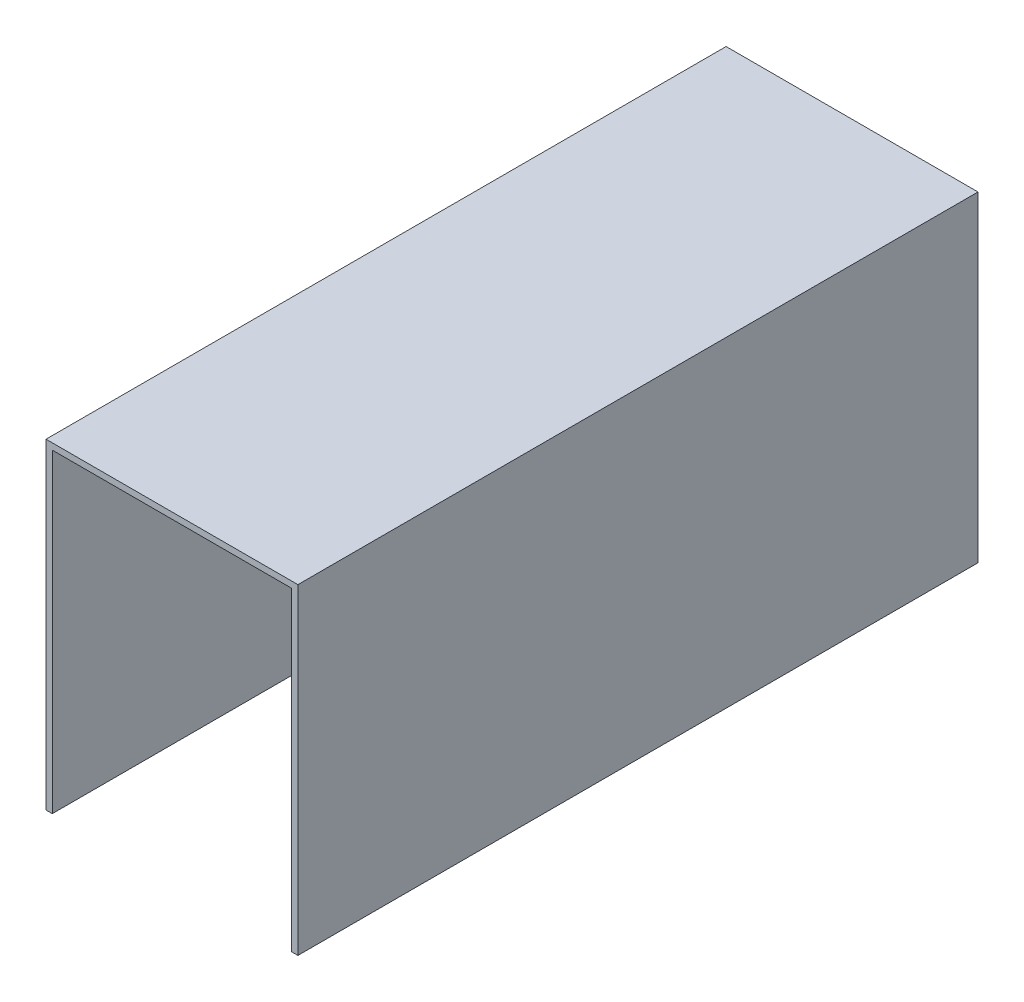
ISO-10303-21;
HEADER;
FILE_DESCRIPTION(('STEP AP214'),'2;1');
FILE_NAME('part.step','',(''),(''),'','','');
FILE_SCHEMA(('AUTOMOTIVE_DESIGN { 1 0 10303 214 1 1 1 1 }'));
ENDSEC;
DATA;
#1=APPLICATION_CONTEXT('core data for automotive mechanical design processes');
#2=APPLICATION_PROTOCOL_DEFINITION('international standard','automotive_design',2000,#1);
#3=PRODUCT_CONTEXT('',#1,'mechanical');
#4=PRODUCT('Part','Part','',(#3));
#5=PRODUCT_RELATED_PRODUCT_CATEGORY('part','',(#4));
#6=PRODUCT_DEFINITION_FORMATION('','',#4);
#7=PRODUCT_DEFINITION_CONTEXT('part definition',#1,'design');
#8=PRODUCT_DEFINITION('design','',#6,#7);
#9=PRODUCT_DEFINITION_SHAPE('','',#8);
#10=(LENGTH_UNIT() NAMED_UNIT(*) SI_UNIT(.MILLI.,.METRE.));
#11=(NAMED_UNIT(*) PLANE_ANGLE_UNIT() SI_UNIT($,.RADIAN.));
#12=(NAMED_UNIT(*) SI_UNIT($,.STERADIAN.) SOLID_ANGLE_UNIT());
#13=UNCERTAINTY_MEASURE_WITH_UNIT(LENGTH_MEASURE(1.E-05),#10,'distance_accuracy_value','');
#14=(GEOMETRIC_REPRESENTATION_CONTEXT(3) GLOBAL_UNCERTAINTY_ASSIGNED_CONTEXT((#13)) GLOBAL_UNIT_ASSIGNED_CONTEXT((#10,
#11,#12)) REPRESENTATION_CONTEXT('',''));
#15=CARTESIAN_POINT('',(0.,0.,0.));
#16=DIRECTION('',(0.,0.,1.));
#17=DIRECTION('',(1.,0.,0.));
#18=AXIS2_PLACEMENT_3D('',#15,#16,#17);
#19=CARTESIAN_POINT('',(-8.33627502634351,0.,108.));
#20=DIRECTION('',(0.,1.,0.));
#21=DIRECTION('',(0.,0.,1.));
#22=AXIS2_PLACEMENT_3D('',#19,#20,#21);
#23=PLANE('',#22);
#24=DIRECTION('',(1.,0.,0.));
#25=VECTOR('',#24,1.);
#26=CARTESIAN_POINT('',(-8.33627502634351,0.,0.));
#27=LINE('',#26,#25);
#28=CARTESIAN_POINT('',(-8.33627502634351,0.,0.));
#29=VERTEX_POINT('',#28);
#30=CARTESIAN_POINT('',(-7.33627502634351,0.,0.));
#31=VERTEX_POINT('',#30);
#32=EDGE_CURVE('E133',#29,#31,#27,.T.);
#33=ORIENTED_EDGE('',*,*,#32,.T.);
#34=DIRECTION('',(0.,0.,-1.));
#35=VECTOR('',#34,1.);
#36=CARTESIAN_POINT('',(-7.33627502634351,0.,108.));
#37=LINE('',#36,#35);
#38=CARTESIAN_POINT('',(-7.33627502634351,0.,108.));
#39=VERTEX_POINT('',#38);
#40=EDGE_CURVE('E11',#39,#31,#37,.T.);
#41=ORIENTED_EDGE('',*,*,#40,.F.);
#42=DIRECTION('',(1.,0.,0.));
#43=VECTOR('',#42,1.);
#44=CARTESIAN_POINT('',(-8.33627502634351,0.,108.));
#45=LINE('',#44,#43);
#46=CARTESIAN_POINT('',(-8.33627502634351,0.,108.));
#47=VERTEX_POINT('',#46);
#48=EDGE_CURVE('E147',#47,#39,#45,.T.);
#49=ORIENTED_EDGE('',*,*,#48,.F.);
#50=DIRECTION('',(0.,0.,-1.));
#51=VECTOR('',#50,1.);
#52=CARTESIAN_POINT('',(-8.33627502634351,0.,108.));
#53=LINE('',#52,#51);
#54=EDGE_CURVE('E129',#47,#29,#53,.T.);
#55=ORIENTED_EDGE('',*,*,#54,.T.);
#56=EDGE_LOOP('',(#33,#41,#49,#55));
#57=FACE_BOUND('',#56,.T.);
#58=ADVANCED_FACE('F37',(#57),#23,.F.);
#59=CARTESIAN_POINT('',(-7.33627502634351,0.,108.));
#60=DIRECTION('',(-1.,0.,0.));
#61=DIRECTION('',(0.,0.,1.));
#62=AXIS2_PLACEMENT_3D('',#59,#60,#61);
#63=PLANE('',#62);
#64=DIRECTION('',(0.,1.,0.));
#65=VECTOR('',#64,1.);
#66=CARTESIAN_POINT('',(-7.33627502634351,0.,0.));
#67=LINE('',#66,#65);
#68=CARTESIAN_POINT('',(-7.33627502634351,50.,0.));
#69=VERTEX_POINT('',#68);
#70=EDGE_CURVE('E136',#31,#69,#67,.T.);
#71=ORIENTED_EDGE('',*,*,#70,.T.);
#72=DIRECTION('',(0.,0.,-1.));
#73=VECTOR('',#72,1.);
#74=CARTESIAN_POINT('',(-7.33627502634351,50.,108.));
#75=LINE('',#74,#73);
#76=CARTESIAN_POINT('',(-7.33627502634351,50.,108.));
#77=VERTEX_POINT('',#76);
#78=EDGE_CURVE('E45',#77,#69,#75,.T.);
#79=ORIENTED_EDGE('',*,*,#78,.F.);
#80=DIRECTION('',(0.,1.,0.));
#81=VECTOR('',#80,1.);
#82=CARTESIAN_POINT('',(-7.33627502634351,0.,108.));
#83=LINE('',#82,#81);
#84=EDGE_CURVE('E96',#39,#77,#83,.T.);
#85=ORIENTED_EDGE('',*,*,#84,.F.);
#86=ORIENTED_EDGE('',*,*,#40,.T.);
#87=EDGE_LOOP('',(#71,#79,#85,#86));
#88=FACE_BOUND('',#87,.T.);
#89=ADVANCED_FACE('F182',(#88),#63,.F.);
#90=CARTESIAN_POINT('',(-7.33627502634351,50.,108.));
#91=DIRECTION('',(0.,1.,0.));
#92=DIRECTION('',(-1.,0.,0.));
#93=AXIS2_PLACEMENT_3D('',#90,#91,#92);
#94=PLANE('',#93);
#95=DIRECTION('',(1.,0.,0.));
#96=VECTOR('',#95,1.);
#97=CARTESIAN_POINT('',(-7.33627502634351,50.,0.));
#98=LINE('',#97,#96);
#99=CARTESIAN_POINT('',(30.6637249736565,50.,0.));
#100=VERTEX_POINT('',#99);
#101=EDGE_CURVE('E138',#69,#100,#98,.T.);
#102=ORIENTED_EDGE('',*,*,#101,.T.);
#103=DIRECTION('',(0.,0.,-1.));
#104=VECTOR('',#103,1.);
#105=CARTESIAN_POINT('',(30.6637249736565,50.,108.));
#106=LINE('',#105,#104);
#107=CARTESIAN_POINT('',(30.6637249736565,50.,108.));
#108=VERTEX_POINT('',#107);
#109=EDGE_CURVE('E154',#108,#100,#106,.T.);
#110=ORIENTED_EDGE('',*,*,#109,.F.);
#111=DIRECTION('',(1.,0.,0.));
#112=VECTOR('',#111,1.);
#113=CARTESIAN_POINT('',(-7.33627502634351,50.,108.));
#114=LINE('',#113,#112);
#115=EDGE_CURVE('E162',#77,#108,#114,.T.);
#116=ORIENTED_EDGE('',*,*,#115,.F.);
#117=ORIENTED_EDGE('',*,*,#78,.T.);
#118=EDGE_LOOP('',(#102,#110,#116,#117));
#119=FACE_BOUND('',#118,.T.);
#120=ADVANCED_FACE('F160',(#119),#94,.F.);
#121=CARTESIAN_POINT('',(30.6637249736565,50.,108.));
#122=DIRECTION('',(1.,0.,0.));
#123=DIRECTION('',(0.,1.,0.));
#124=AXIS2_PLACEMENT_3D('',#121,#122,#123);
#125=PLANE('',#124);
#126=DIRECTION('',(0.,-1.,0.));
#127=VECTOR('',#126,1.);
#128=CARTESIAN_POINT('',(30.6637249736565,50.,0.));
#129=LINE('',#128,#127);
#130=CARTESIAN_POINT('',(30.6637249736565,0.,0.));
#131=VERTEX_POINT('',#130);
#132=EDGE_CURVE('E140',#100,#131,#129,.T.);
#133=ORIENTED_EDGE('',*,*,#132,.T.);
#134=DIRECTION('',(0.,0.,-1.));
#135=VECTOR('',#134,1.);
#136=CARTESIAN_POINT('',(30.6637249736565,0.,108.));
#137=LINE('',#136,#135);
#138=CARTESIAN_POINT('',(30.6637249736565,0.,108.));
#139=VERTEX_POINT('',#138);
#140=EDGE_CURVE('E151',#139,#131,#137,.T.);
#141=ORIENTED_EDGE('',*,*,#140,.F.);
#142=DIRECTION('',(0.,-1.,0.));
#143=VECTOR('',#142,1.);
#144=CARTESIAN_POINT('',(30.6637249736565,50.,108.));
#145=LINE('',#144,#143);
#146=EDGE_CURVE('E174',#108,#139,#145,.T.);
#147=ORIENTED_EDGE('',*,*,#146,.F.);
#148=ORIENTED_EDGE('',*,*,#109,.T.);
#149=EDGE_LOOP('',(#133,#141,#147,#148));
#150=FACE_BOUND('',#149,.T.);
#151=ADVANCED_FACE('F170',(#150),#125,.F.);
#152=CARTESIAN_POINT('',(30.6637249736565,0.,108.));
#153=DIRECTION('',(0.,1.,0.));
#154=DIRECTION('',(0.,0.,1.));
#155=AXIS2_PLACEMENT_3D('',#152,#153,#154);
#156=PLANE('',#155);
#157=DIRECTION('',(1.,0.,0.));
#158=VECTOR('',#157,1.);
#159=CARTESIAN_POINT('',(30.6637249736565,0.,0.));
#160=LINE('',#159,#158);
#161=CARTESIAN_POINT('',(31.6637249736565,0.,0.));
#162=VERTEX_POINT('',#161);
#163=EDGE_CURVE('E142',#131,#162,#160,.T.);
#164=ORIENTED_EDGE('',*,*,#163,.T.);
#165=DIRECTION('',(0.,0.,-1.));
#166=VECTOR('',#165,1.);
#167=CARTESIAN_POINT('',(31.6637249736565,0.,108.));
#168=LINE('',#167,#166);
#169=CARTESIAN_POINT('',(31.6637249736565,0.,108.));
#170=VERTEX_POINT('',#169);
#171=EDGE_CURVE('E124',#170,#162,#168,.T.);
#172=ORIENTED_EDGE('',*,*,#171,.F.);
#173=DIRECTION('',(1.,0.,0.));
#174=VECTOR('',#173,1.);
#175=CARTESIAN_POINT('',(30.6637249736565,0.,108.));
#176=LINE('',#175,#174);
#177=EDGE_CURVE('E115',#139,#170,#176,.T.);
#178=ORIENTED_EDGE('',*,*,#177,.F.);
#179=ORIENTED_EDGE('',*,*,#140,.T.);
#180=EDGE_LOOP('',(#164,#172,#178,#179));
#181=FACE_BOUND('',#180,.T.);
#182=ADVANCED_FACE('F173',(#181),#156,.F.);
#183=CARTESIAN_POINT('',(31.6637249736565,0.,108.));
#184=DIRECTION('',(-1.,0.,0.));
#185=DIRECTION('',(0.,0.,1.));
#186=AXIS2_PLACEMENT_3D('',#183,#184,#185);
#187=PLANE('',#186);
#188=DIRECTION('',(0.,1.,0.));
#189=VECTOR('',#188,1.);
#190=CARTESIAN_POINT('',(31.6637249736565,0.,0.));
#191=LINE('',#190,#189);
#192=CARTESIAN_POINT('',(31.6637249736565,51.,0.));
#193=VERTEX_POINT('',#192);
#194=EDGE_CURVE('E123',#162,#193,#191,.T.);
#195=ORIENTED_EDGE('',*,*,#194,.T.);
#196=DIRECTION('',(0.,0.,-1.));
#197=VECTOR('',#196,1.);
#198=CARTESIAN_POINT('',(31.6637249736565,51.,108.));
#199=LINE('',#198,#197);
#200=CARTESIAN_POINT('',(31.6637249736565,51.,108.));
#201=VERTEX_POINT('',#200);
#202=EDGE_CURVE('E120',#201,#193,#199,.T.);
#203=ORIENTED_EDGE('',*,*,#202,.F.);
#204=DIRECTION('',(0.,1.,0.));
#205=VECTOR('',#204,1.);
#206=CARTESIAN_POINT('',(31.6637249736565,0.,108.));
#207=LINE('',#206,#205);
#208=EDGE_CURVE('E109',#170,#201,#207,.T.);
#209=ORIENTED_EDGE('',*,*,#208,.F.);
#210=ORIENTED_EDGE('',*,*,#171,.T.);
#211=EDGE_LOOP('',(#195,#203,#209,#210));
#212=FACE_BOUND('',#211,.T.);
#213=ADVANCED_FACE('F121',(#212),#187,.F.);
#214=CARTESIAN_POINT('',(31.6637249736565,51.,108.));
#215=DIRECTION('',(0.,-1.,0.));
#216=DIRECTION('',(1.,0.,0.));
#217=AXIS2_PLACEMENT_3D('',#214,#215,#216);
#218=PLANE('',#217);
#219=DIRECTION('',(-1.,0.,0.));
#220=VECTOR('',#219,1.);
#221=CARTESIAN_POINT('',(31.6637249736565,51.,0.));
#222=LINE('',#221,#220);
#223=CARTESIAN_POINT('',(-8.33627502634352,51.,0.));
#224=VERTEX_POINT('',#223);
#225=EDGE_CURVE('E82',#193,#224,#222,.T.);
#226=ORIENTED_EDGE('',*,*,#225,.T.);
#227=DIRECTION('',(0.,0.,-1.));
#228=VECTOR('',#227,1.);
#229=CARTESIAN_POINT('',(-8.33627502634352,51.,108.));
#230=LINE('',#229,#228);
#231=CARTESIAN_POINT('',(-8.33627502634352,51.,108.));
#232=VERTEX_POINT('',#231);
#233=EDGE_CURVE('E125',#232,#224,#230,.T.);
#234=ORIENTED_EDGE('',*,*,#233,.F.);
#235=DIRECTION('',(-1.,0.,0.));
#236=VECTOR('',#235,1.);
#237=CARTESIAN_POINT('',(31.6637249736565,51.,108.));
#238=LINE('',#237,#236);
#239=EDGE_CURVE('E113',#201,#232,#238,.T.);
#240=ORIENTED_EDGE('',*,*,#239,.F.);
#241=ORIENTED_EDGE('',*,*,#202,.T.);
#242=EDGE_LOOP('',(#226,#234,#240,#241));
#243=FACE_BOUND('',#242,.T.);
#244=ADVANCED_FACE('F127',(#243),#218,.F.);
#245=CARTESIAN_POINT('',(-8.33627502634352,51.,108.));
#246=DIRECTION('',(1.,0.,0.));
#247=DIRECTION('',(0.,1.,0.));
#248=AXIS2_PLACEMENT_3D('',#245,#246,#247);
#249=PLANE('',#248);
#250=DIRECTION('',(0.,-1.,0.));
#251=VECTOR('',#250,1.);
#252=CARTESIAN_POINT('',(-8.33627502634352,51.,0.));
#253=LINE('',#252,#251);
#254=EDGE_CURVE('E88',#224,#29,#253,.T.);
#255=ORIENTED_EDGE('',*,*,#254,.T.);
#256=ORIENTED_EDGE('',*,*,#54,.F.);
#257=DIRECTION('',(0.,-1.,0.));
#258=VECTOR('',#257,1.);
#259=CARTESIAN_POINT('',(-8.33627502634352,51.,108.));
#260=LINE('',#259,#258);
#261=EDGE_CURVE('E53',#232,#47,#260,.T.);
#262=ORIENTED_EDGE('',*,*,#261,.F.);
#263=ORIENTED_EDGE('',*,*,#233,.T.);
#264=EDGE_LOOP('',(#255,#256,#262,#263));
#265=FACE_BOUND('',#264,.T.);
#266=ADVANCED_FACE('F198',(#265),#249,.F.);
#267=CARTESIAN_POINT('',(0.,0.,108.));
#268=DIRECTION('',(0.,0.,1.));
#269=DIRECTION('',(1.,0.,0.));
#270=AXIS2_PLACEMENT_3D('',#267,#268,#269);
#271=PLANE('',#270);
#272=ORIENTED_EDGE('',*,*,#48,.T.);
#273=ORIENTED_EDGE('',*,*,#84,.T.);
#274=ORIENTED_EDGE('',*,*,#115,.T.);
#275=ORIENTED_EDGE('',*,*,#146,.T.);
#276=ORIENTED_EDGE('',*,*,#177,.T.);
#277=ORIENTED_EDGE('',*,*,#208,.T.);
#278=ORIENTED_EDGE('',*,*,#239,.T.);
#279=ORIENTED_EDGE('',*,*,#261,.T.);
#280=EDGE_LOOP('',(#272,#273,#274,#275,#276,#277,#278,#279));
#281=FACE_BOUND('',#280,.T.);
#282=ADVANCED_FACE('F111',(#281),#271,.T.);
#283=CARTESIAN_POINT('',(0.,0.,0.));
#284=DIRECTION('',(0.,0.,1.));
#285=DIRECTION('',(1.,0.,0.));
#286=AXIS2_PLACEMENT_3D('',#283,#284,#285);
#287=PLANE('',#286);
#288=ORIENTED_EDGE('',*,*,#32,.F.);
#289=ORIENTED_EDGE('',*,*,#254,.F.);
#290=ORIENTED_EDGE('',*,*,#225,.F.);
#291=ORIENTED_EDGE('',*,*,#194,.F.);
#292=ORIENTED_EDGE('',*,*,#163,.F.);
#293=ORIENTED_EDGE('',*,*,#132,.F.);
#294=ORIENTED_EDGE('',*,*,#101,.F.);
#295=ORIENTED_EDGE('',*,*,#70,.F.);
#296=EDGE_LOOP('',(#288,#289,#290,#291,#292,#293,#294,#295));
#297=FACE_BOUND('',#296,.T.);
#298=ADVANCED_FACE('F166',(#297),#287,.F.);
#299=CLOSED_SHELL('',(#58,#89,#120,#151,#182,#213,#244,#266,#282,#298));
#300=MANIFOLD_SOLID_BREP('B2',#299);
#301=ADVANCED_BREP_SHAPE_REPRESENTATION('',(#18,#300),#14);
#302=SHAPE_DEFINITION_REPRESENTATION(#9,#301);
ENDSEC;
END-ISO-10303-21;
